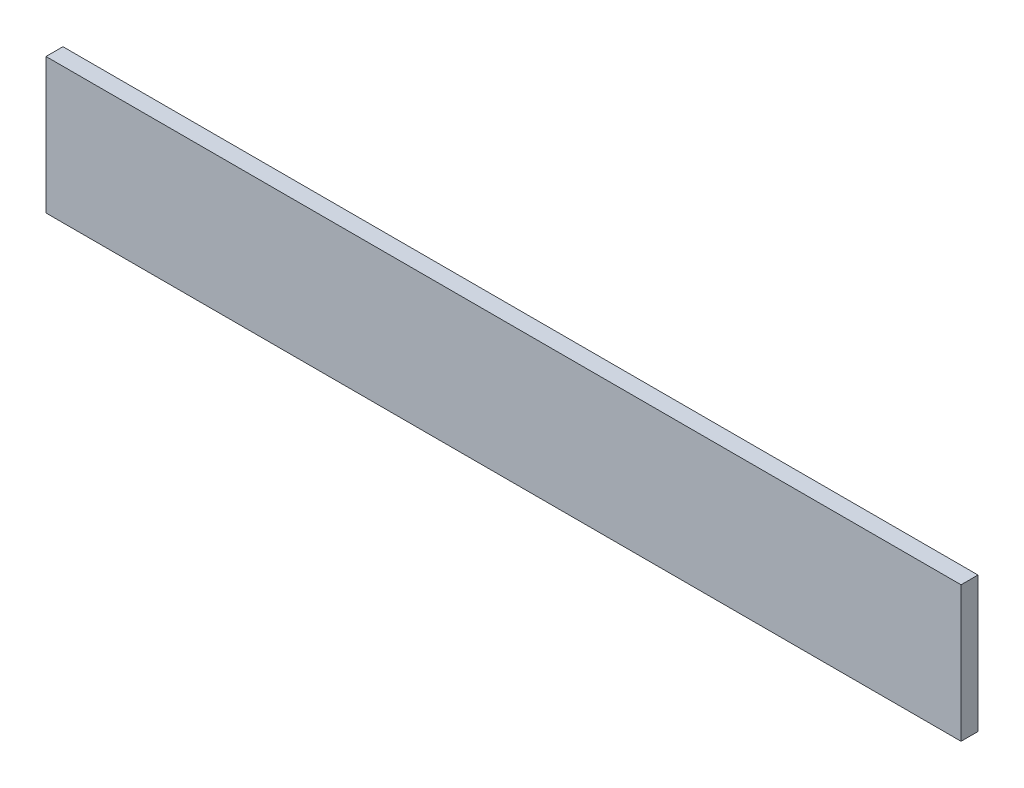
ISO-10303-21;
HEADER;
FILE_DESCRIPTION(('STEP AP214'),'2;1');
FILE_NAME('part.step','',(''),(''),'','','');
FILE_SCHEMA(('AUTOMOTIVE_DESIGN { 1 0 10303 214 1 1 1 1 }'));
ENDSEC;
DATA;
#1=APPLICATION_CONTEXT('core data for automotive mechanical design processes');
#2=APPLICATION_PROTOCOL_DEFINITION('international standard','automotive_design',2000,#1);
#3=PRODUCT_CONTEXT('',#1,'mechanical');
#4=PRODUCT('Part','Part','',(#3));
#5=PRODUCT_RELATED_PRODUCT_CATEGORY('part','',(#4));
#6=PRODUCT_DEFINITION_FORMATION('','',#4);
#7=PRODUCT_DEFINITION_CONTEXT('part definition',#1,'design');
#8=PRODUCT_DEFINITION('design','',#6,#7);
#9=PRODUCT_DEFINITION_SHAPE('','',#8);
#10=(LENGTH_UNIT() NAMED_UNIT(*) SI_UNIT(.MILLI.,.METRE.));
#11=(NAMED_UNIT(*) PLANE_ANGLE_UNIT() SI_UNIT($,.RADIAN.));
#12=(NAMED_UNIT(*) SI_UNIT($,.STERADIAN.) SOLID_ANGLE_UNIT());
#13=UNCERTAINTY_MEASURE_WITH_UNIT(LENGTH_MEASURE(1.E-05),#10,'distance_accuracy_value','');
#14=(GEOMETRIC_REPRESENTATION_CONTEXT(3) GLOBAL_UNCERTAINTY_ASSIGNED_CONTEXT((#13)) GLOBAL_UNIT_ASSIGNED_CONTEXT((#10,
#11,#12)) REPRESENTATION_CONTEXT('',''));
#15=CARTESIAN_POINT('',(0.,0.,0.));
#16=DIRECTION('',(0.,0.,1.));
#17=DIRECTION('',(1.,0.,0.));
#18=AXIS2_PLACEMENT_3D('',#15,#16,#17);
#19=CARTESIAN_POINT('',(135.,90.,5.));
#20=DIRECTION('',(-1.,0.,0.));
#21=DIRECTION('',(0.,-1.,0.));
#22=AXIS2_PLACEMENT_3D('',#19,#20,#21);
#23=PLANE('',#22);
#24=DIRECTION('',(0.,0.,-1.));
#25=VECTOR('',#24,1.);
#26=CARTESIAN_POINT('',(135.,-50.,5.));
#27=LINE('',#26,#25);
#28=CARTESIAN_POINT('',(135.,-50.,5.));
#29=VERTEX_POINT('',#28);
#30=CARTESIAN_POINT('',(135.,-49.9999999999999,0.));
#31=VERTEX_POINT('',#30);
#32=EDGE_CURVE('E47',#29,#31,#27,.T.);
#33=ORIENTED_EDGE('',*,*,#32,.F.);
#34=DIRECTION('',(0.,1.,0.));
#35=VECTOR('',#34,1.);
#36=CARTESIAN_POINT('',(135.,90.,5.));
#37=LINE('',#36,#35);
#38=CARTESIAN_POINT('',(135.,-90.,5.));
#39=VERTEX_POINT('',#38);
#40=EDGE_CURVE('E76',#39,#29,#37,.T.);
#41=ORIENTED_EDGE('',*,*,#40,.F.);
#42=DIRECTION('',(0.,0.,-1.));
#43=VECTOR('',#42,1.);
#44=CARTESIAN_POINT('',(135.,-90.,5.));
#45=LINE('',#44,#43);
#46=CARTESIAN_POINT('',(135.,-90.,0.));
#47=VERTEX_POINT('',#46);
#48=EDGE_CURVE('E40',#39,#47,#45,.T.);
#49=ORIENTED_EDGE('',*,*,#48,.T.);
#50=DIRECTION('',(0.,1.,0.));
#51=VECTOR('',#50,1.);
#52=CARTESIAN_POINT('',(135.,90.,0.));
#53=LINE('',#52,#51);
#54=EDGE_CURVE('E81',#47,#31,#53,.T.);
#55=ORIENTED_EDGE('',*,*,#54,.T.);
#56=EDGE_LOOP('',(#33,#41,#49,#55));
#57=FACE_BOUND('',#56,.T.);
#58=ADVANCED_FACE('F33',(#57),#23,.F.);
#59=CARTESIAN_POINT('',(-135.,90.,5.));
#60=DIRECTION('',(1.,0.,0.));
#61=DIRECTION('',(0.,1.,0.));
#62=AXIS2_PLACEMENT_3D('',#59,#60,#61);
#63=PLANE('',#62);
#64=DIRECTION('',(0.,0.,1.));
#65=VECTOR('',#64,1.);
#66=CARTESIAN_POINT('',(-135.,-50.,5.));
#67=LINE('',#66,#65);
#68=CARTESIAN_POINT('',(-135.,-50.,0.));
#69=VERTEX_POINT('',#68);
#70=CARTESIAN_POINT('',(-135.,-50.,5.));
#71=VERTEX_POINT('',#70);
#72=EDGE_CURVE('E87',#69,#71,#67,.T.);
#73=ORIENTED_EDGE('',*,*,#72,.F.);
#74=DIRECTION('',(0.,-1.,0.));
#75=VECTOR('',#74,1.);
#76=CARTESIAN_POINT('',(-135.,90.,0.));
#77=LINE('',#76,#75);
#78=CARTESIAN_POINT('',(-135.,-90.,0.));
#79=VERTEX_POINT('',#78);
#80=EDGE_CURVE('E77',#69,#79,#77,.T.);
#81=ORIENTED_EDGE('',*,*,#80,.T.);
#82=DIRECTION('',(0.,0.,-1.));
#83=VECTOR('',#82,1.);
#84=CARTESIAN_POINT('',(-135.,-90.,5.));
#85=LINE('',#84,#83);
#86=CARTESIAN_POINT('',(-135.,-90.,5.));
#87=VERTEX_POINT('',#86);
#88=EDGE_CURVE('E11',#87,#79,#85,.T.);
#89=ORIENTED_EDGE('',*,*,#88,.F.);
#90=DIRECTION('',(0.,-1.,0.));
#91=VECTOR('',#90,1.);
#92=CARTESIAN_POINT('',(-135.,90.,5.));
#93=LINE('',#92,#91);
#94=EDGE_CURVE('E91',#71,#87,#93,.T.);
#95=ORIENTED_EDGE('',*,*,#94,.F.);
#96=EDGE_LOOP('',(#73,#81,#89,#95));
#97=FACE_BOUND('',#96,.T.);
#98=ADVANCED_FACE('F105',(#97),#63,.F.);
#99=CARTESIAN_POINT('',(0.,0.,5.));
#100=DIRECTION('',(0.,0.,1.));
#101=DIRECTION('',(1.,0.,0.));
#102=AXIS2_PLACEMENT_3D('',#99,#100,#101);
#103=PLANE('',#102);
#104=ORIENTED_EDGE('',*,*,#40,.T.);
#105=DIRECTION('',(1.,0.,0.));
#106=VECTOR('',#105,1.);
#107=CARTESIAN_POINT('',(135.,-50.,5.));
#108=LINE('',#107,#106);
#109=EDGE_CURVE('E84',#71,#29,#108,.T.);
#110=ORIENTED_EDGE('',*,*,#109,.F.);
#111=ORIENTED_EDGE('',*,*,#94,.T.);
#112=DIRECTION('',(1.,0.,0.));
#113=VECTOR('',#112,1.);
#114=CARTESIAN_POINT('',(-135.,-90.,5.));
#115=LINE('',#114,#113);
#116=EDGE_CURVE('E56',#87,#39,#115,.T.);
#117=ORIENTED_EDGE('',*,*,#116,.T.);
#118=EDGE_LOOP('',(#104,#110,#111,#117));
#119=FACE_BOUND('',#118,.T.);
#120=ADVANCED_FACE('F107',(#119),#103,.T.);
#121=CARTESIAN_POINT('',(0.,0.,0.));
#122=DIRECTION('',(0.,0.,1.));
#123=DIRECTION('',(1.,0.,0.));
#124=AXIS2_PLACEMENT_3D('',#121,#122,#123);
#125=PLANE('',#124);
#126=DIRECTION('',(-1.,0.,0.));
#127=VECTOR('',#126,1.);
#128=CARTESIAN_POINT('',(135.,-50.,0.));
#129=LINE('',#128,#127);
#130=EDGE_CURVE('E83',#31,#69,#129,.T.);
#131=ORIENTED_EDGE('',*,*,#130,.F.);
#132=ORIENTED_EDGE('',*,*,#54,.F.);
#133=DIRECTION('',(1.,0.,0.));
#134=VECTOR('',#133,1.);
#135=CARTESIAN_POINT('',(-135.,-90.,0.));
#136=LINE('',#135,#134);
#137=EDGE_CURVE('E68',#79,#47,#136,.T.);
#138=ORIENTED_EDGE('',*,*,#137,.F.);
#139=ORIENTED_EDGE('',*,*,#80,.F.);
#140=EDGE_LOOP('',(#131,#132,#138,#139));
#141=FACE_BOUND('',#140,.T.);
#142=ADVANCED_FACE('F82',(#141),#125,.F.);
#143=CARTESIAN_POINT('',(-135.,-90.,5.));
#144=DIRECTION('',(0.,1.,0.));
#145=DIRECTION('',(0.,0.,1.));
#146=AXIS2_PLACEMENT_3D('',#143,#144,#145);
#147=PLANE('',#146);
#148=ORIENTED_EDGE('',*,*,#137,.T.);
#149=ORIENTED_EDGE('',*,*,#48,.F.);
#150=ORIENTED_EDGE('',*,*,#116,.F.);
#151=ORIENTED_EDGE('',*,*,#88,.T.);
#152=EDGE_LOOP('',(#148,#149,#150,#151));
#153=FACE_BOUND('',#152,.T.);
#154=ADVANCED_FACE('F70',(#153),#147,.F.);
#155=CARTESIAN_POINT('',(0.,-50.,0.));
#156=DIRECTION('',(0.,1.,0.));
#157=DIRECTION('',(0.,0.,1.));
#158=AXIS2_PLACEMENT_3D('',#155,#156,#157);
#159=PLANE('',#158);
#160=ORIENTED_EDGE('',*,*,#32,.T.);
#161=ORIENTED_EDGE('',*,*,#130,.T.);
#162=ORIENTED_EDGE('',*,*,#72,.T.);
#163=ORIENTED_EDGE('',*,*,#109,.T.);
#164=EDGE_LOOP('',(#160,#161,#162,#163));
#165=FACE_BOUND('',#164,.T.);
#166=ADVANCED_FACE('F99',(#165),#159,.T.);
#167=CLOSED_SHELL('',(#58,#98,#120,#142,#154,#166));
#168=MANIFOLD_SOLID_BREP('B2',#167);
#169=ADVANCED_BREP_SHAPE_REPRESENTATION('',(#18,#168),#14);
#170=SHAPE_DEFINITION_REPRESENTATION(#9,#169);
ENDSEC;
END-ISO-10303-21;
